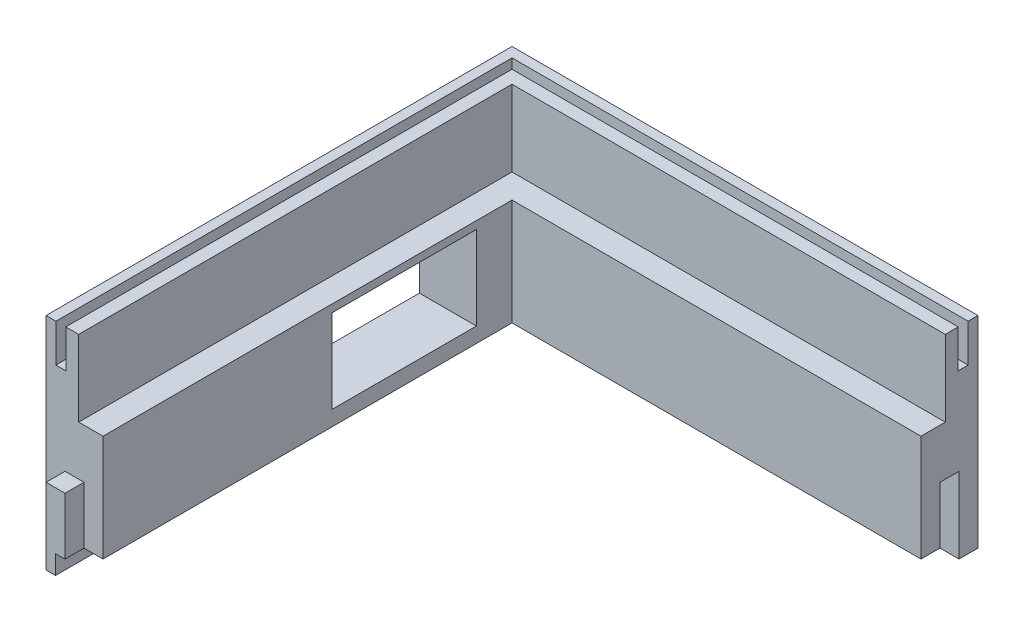
ISO-10303-21;
HEADER;
FILE_DESCRIPTION(('STEP AP214'),'2;1');
FILE_NAME('part.step','',(''),(''),'','','');
FILE_SCHEMA(('AUTOMOTIVE_DESIGN { 1 0 10303 214 1 1 1 1 }'));
ENDSEC;
DATA;
#1=APPLICATION_CONTEXT('core data for automotive mechanical design processes');
#2=APPLICATION_PROTOCOL_DEFINITION('international standard','automotive_design',2000,#1);
#3=PRODUCT_CONTEXT('',#1,'mechanical');
#4=PRODUCT('Part','Part','',(#3));
#5=PRODUCT_RELATED_PRODUCT_CATEGORY('part','',(#4));
#6=PRODUCT_DEFINITION_FORMATION('','',#4);
#7=PRODUCT_DEFINITION_CONTEXT('part definition',#1,'design');
#8=PRODUCT_DEFINITION('design','',#6,#7);
#9=PRODUCT_DEFINITION_SHAPE('','',#8);
#10=(LENGTH_UNIT() NAMED_UNIT(*) SI_UNIT(.MILLI.,.METRE.));
#11=(NAMED_UNIT(*) PLANE_ANGLE_UNIT() SI_UNIT($,.RADIAN.));
#12=(NAMED_UNIT(*) SI_UNIT($,.STERADIAN.) SOLID_ANGLE_UNIT());
#13=UNCERTAINTY_MEASURE_WITH_UNIT(LENGTH_MEASURE(1.E-05),#10,'distance_accuracy_value','');
#14=(GEOMETRIC_REPRESENTATION_CONTEXT(3) GLOBAL_UNCERTAINTY_ASSIGNED_CONTEXT((#13)) GLOBAL_UNIT_ASSIGNED_CONTEXT((#10,
#11,#12)) REPRESENTATION_CONTEXT('',''));
#15=CARTESIAN_POINT('',(0.,0.,0.));
#16=DIRECTION('',(0.,0.,1.));
#17=DIRECTION('',(1.,0.,0.));
#18=AXIS2_PLACEMENT_3D('',#15,#16,#17);
#19=CARTESIAN_POINT('',(88.7463944008104,0.,0.));
#20=DIRECTION('',(-1.,0.,0.));
#21=DIRECTION('',(0.,0.,1.));
#22=AXIS2_PLACEMENT_3D('',#19,#20,#21);
#23=PLANE('',#22);
#24=DIRECTION('',(0.,1.,0.));
#25=VECTOR('',#24,1.);
#26=CARTESIAN_POINT('',(88.7463944008104,-377.380678756983,-28.1385049718995));
#27=LINE('',#26,#25);
#28=CARTESIAN_POINT('',(88.7463944008104,0.,-28.1385049718995));
#29=VERTEX_POINT('',#28);
#30=CARTESIAN_POINT('',(88.7463944008104,6.35,-28.1385049718995));
#31=VERTEX_POINT('',#30);
#32=EDGE_CURVE('E277',#29,#31,#27,.T.);
#33=ORIENTED_EDGE('',*,*,#32,.F.);
#34=DIRECTION('',(0.,0.,-1.));
#35=VECTOR('',#34,1.);
#36=CARTESIAN_POINT('',(88.7463944008104,0.,-24.9635049718995));
#37=LINE('',#36,#35);
#38=CARTESIAN_POINT('',(88.7463944008104,0.,-31.3135049718995));
#39=VERTEX_POINT('',#38);
#40=EDGE_CURVE('E325',#29,#39,#37,.T.);
#41=ORIENTED_EDGE('',*,*,#40,.T.);
#42=DIRECTION('',(0.,1.,0.));
#43=VECTOR('',#42,1.);
#44=CARTESIAN_POINT('',(88.7463944008104,0.,-31.3135049718995));
#45=LINE('',#44,#43);
#46=CARTESIAN_POINT('',(88.7463944008104,25.4,-31.3135049718995));
#47=VERTEX_POINT('',#46);
#48=EDGE_CURVE('E328',#39,#47,#45,.T.);
#49=ORIENTED_EDGE('',*,*,#48,.T.);
#50=DIRECTION('',(0.,0.,1.));
#51=VECTOR('',#50,1.);
#52=CARTESIAN_POINT('',(88.7463944008104,25.4,-24.9635049718995));
#53=LINE('',#52,#51);
#54=CARTESIAN_POINT('',(88.7463944008104,25.4,-24.9635049718995));
#55=VERTEX_POINT('',#54);
#56=EDGE_CURVE('E331',#47,#55,#53,.T.);
#57=ORIENTED_EDGE('',*,*,#56,.T.);
#58=DIRECTION('',(0.,-1.,0.));
#59=VECTOR('',#58,1.);
#60=CARTESIAN_POINT('',(88.7463944008104,0.,-24.9635049718995));
#61=LINE('',#60,#59);
#62=CARTESIAN_POINT('',(88.7463944008104,6.35,-24.9635049718995));
#63=VERTEX_POINT('',#62);
#64=EDGE_CURVE('E322',#55,#63,#61,.T.);
#65=ORIENTED_EDGE('',*,*,#64,.T.);
#66=DIRECTION('',(0.,0.,-1.));
#67=VECTOR('',#66,1.);
#68=CARTESIAN_POINT('',(88.7463944008104,6.35,-24.9635049718995));
#69=LINE('',#68,#67);
#70=EDGE_CURVE('E273',#63,#31,#69,.T.);
#71=ORIENTED_EDGE('',*,*,#70,.T.);
#72=EDGE_LOOP('',(#33,#41,#49,#57,#65,#71));
#73=FACE_BOUND('',#72,.T.);
#74=ADVANCED_FACE('F33',(#73),#23,.F.);
#75=CARTESIAN_POINT('',(0.,67.31,0.));
#76=DIRECTION('',(0.,1.,0.));
#77=DIRECTION('',(0.,0.,1.));
#78=AXIS2_PLACEMENT_3D('',#75,#76,#77);
#79=PLANE('',#78);
#80=DIRECTION('',(0.,0.,1.));
#81=VECTOR('',#80,1.);
#82=CARTESIAN_POINT('',(-57.3036055991896,67.31,118.0384950281));
#83=LINE('',#82,#81);
#84=CARTESIAN_POINT('',(-57.3036055991896,67.31,-34.3615049718995));
#85=VERTEX_POINT('',#84);
#86=CARTESIAN_POINT('',(-57.3036055991896,67.31,118.0384950281));
#87=VERTEX_POINT('',#86);
#88=EDGE_CURVE('E406',#85,#87,#83,.T.);
#89=ORIENTED_EDGE('',*,*,#88,.F.);
#90=DIRECTION('',(-1.,0.,0.));
#91=VECTOR('',#90,1.);
#92=CARTESIAN_POINT('',(-57.3036055991896,67.31,-34.3615049718995));
#93=LINE('',#92,#91);
#94=CARTESIAN_POINT('',(95.0963944008104,67.31,-34.3615049718995));
#95=VERTEX_POINT('',#94);
#96=EDGE_CURVE('E426',#95,#85,#93,.T.);
#97=ORIENTED_EDGE('',*,*,#96,.F.);
#98=DIRECTION('',(0.,0.,1.));
#99=VECTOR('',#98,1.);
#100=CARTESIAN_POINT('',(95.0963944008104,67.31,-37.6635049718995));
#101=LINE('',#100,#99);
#102=CARTESIAN_POINT('',(95.0963944008104,67.31,-37.6635049718995));
#103=VERTEX_POINT('',#102);
#104=EDGE_CURVE('E455',#103,#95,#101,.T.);
#105=ORIENTED_EDGE('',*,*,#104,.F.);
#106=DIRECTION('',(1.,0.,0.));
#107=VECTOR('',#106,1.);
#108=CARTESIAN_POINT('',(-60.6056055991896,67.31,-37.6635049718995));
#109=LINE('',#108,#107);
#110=CARTESIAN_POINT('',(-60.6056055991896,67.31,-37.6635049718995));
#111=VERTEX_POINT('',#110);
#112=EDGE_CURVE('E451',#111,#103,#109,.T.);
#113=ORIENTED_EDGE('',*,*,#112,.F.);
#114=DIRECTION('',(0.,0.,-1.));
#115=VECTOR('',#114,1.);
#116=CARTESIAN_POINT('',(-60.6056055991896,67.31,118.0384950281));
#117=LINE('',#116,#115);
#118=CARTESIAN_POINT('',(-60.6056055991896,67.31,118.0384950281));
#119=VERTEX_POINT('',#118);
#120=EDGE_CURVE('E447',#119,#111,#117,.T.);
#121=ORIENTED_EDGE('',*,*,#120,.F.);
#122=DIRECTION('',(-1.,0.,0.));
#123=VECTOR('',#122,1.);
#124=CARTESIAN_POINT('',(-41.5556055991896,67.31,118.0384950281));
#125=LINE('',#124,#123);
#126=EDGE_CURVE('E448',#87,#119,#125,.T.);
#127=ORIENTED_EDGE('',*,*,#126,.F.);
#128=EDGE_LOOP('',(#89,#97,#105,#113,#121,#127));
#129=FACE_BOUND('',#128,.T.);
#130=ADVANCED_FACE('F552',(#129),#79,.T.);
#131=CARTESIAN_POINT('',(95.0963944008104,67.31,-18.6135049718995));
#132=DIRECTION('',(0.,0.,1.));
#133=DIRECTION('',(1.,0.,0.));
#134=AXIS2_PLACEMENT_3D('',#131,#132,#133);
#135=PLANE('',#134);
#136=DIRECTION('',(-1.,0.,0.));
#137=VECTOR('',#136,1.);
#138=CARTESIAN_POINT('',(95.0963944008104,6.35,-18.6135049718995));
#139=LINE('',#138,#137);
#140=CARTESIAN_POINT('',(95.0963944008104,6.35,-18.6135049718995));
#141=VERTEX_POINT('',#140);
#142=CARTESIAN_POINT('',(-41.5556055991896,6.35,-18.6135049718995));
#143=VERTEX_POINT('',#142);
#144=EDGE_CURVE('E311',#141,#143,#139,.T.);
#145=ORIENTED_EDGE('',*,*,#144,.F.);
#146=DIRECTION('',(0.,-1.,0.));
#147=VECTOR('',#146,1.);
#148=CARTESIAN_POINT('',(95.0963944008104,67.31,-18.6135049718995));
#149=LINE('',#148,#147);
#150=CARTESIAN_POINT('',(95.0963944008104,41.91,-18.6135049718995));
#151=VERTEX_POINT('',#150);
#152=EDGE_CURVE('E11',#151,#141,#149,.T.);
#153=ORIENTED_EDGE('',*,*,#152,.F.);
#154=DIRECTION('',(1.,0.,0.));
#155=VECTOR('',#154,1.);
#156=CARTESIAN_POINT('',(95.0963944008104,41.91,-18.6135049718995));
#157=LINE('',#156,#155);
#158=CARTESIAN_POINT('',(-41.5556055991896,41.91,-18.6135049718995));
#159=VERTEX_POINT('',#158);
#160=EDGE_CURVE('E380',#159,#151,#157,.T.);
#161=ORIENTED_EDGE('',*,*,#160,.F.);
#162=DIRECTION('',(0.,-1.,0.));
#163=VECTOR('',#162,1.);
#164=CARTESIAN_POINT('',(-41.5556055991896,67.31,-18.6135049718995));
#165=LINE('',#164,#163);
#166=EDGE_CURVE('E37',#159,#143,#165,.T.);
#167=ORIENTED_EDGE('',*,*,#166,.T.);
#168=EDGE_LOOP('',(#145,#153,#161,#167));
#169=FACE_BOUND('',#168,.T.);
#170=ADVANCED_FACE('F35',(#169),#135,.T.);
#171=CARTESIAN_POINT('',(95.0963944008104,67.31,-37.6635049718995));
#172=DIRECTION('',(1.,0.,0.));
#173=DIRECTION('',(0.,0.,-1.));
#174=AXIS2_PLACEMENT_3D('',#171,#172,#173);
#175=PLANE('',#174);
#176=DIRECTION('',(0.,0.,1.));
#177=VECTOR('',#176,1.);
#178=CARTESIAN_POINT('',(95.0963944008104,6.35,-37.6635049718995));
#179=LINE('',#178,#177);
#180=CARTESIAN_POINT('',(95.0963944008104,6.35,-24.9635049718995));
#181=VERTEX_POINT('',#180);
#182=EDGE_CURVE('E309',#181,#141,#179,.T.);
#183=ORIENTED_EDGE('',*,*,#182,.F.);
#184=DIRECTION('',(0.,-1.,0.));
#185=VECTOR('',#184,1.);
#186=CARTESIAN_POINT('',(95.0963944008104,0.,-24.9635049718995));
#187=LINE('',#186,#185);
#188=CARTESIAN_POINT('',(95.0963944008104,25.4,-24.9635049718995));
#189=VERTEX_POINT('',#188);
#190=EDGE_CURVE('E304',#189,#181,#187,.T.);
#191=ORIENTED_EDGE('',*,*,#190,.F.);
#192=DIRECTION('',(0.,0.,1.));
#193=VECTOR('',#192,1.);
#194=CARTESIAN_POINT('',(95.0963944008104,25.4,-24.9635049718995));
#195=LINE('',#194,#193);
#196=CARTESIAN_POINT('',(95.0963944008104,25.4,-31.3135049718995));
#197=VERTEX_POINT('',#196);
#198=EDGE_CURVE('E326',#197,#189,#195,.T.);
#199=ORIENTED_EDGE('',*,*,#198,.F.);
#200=DIRECTION('',(0.,1.,0.));
#201=VECTOR('',#200,1.);
#202=CARTESIAN_POINT('',(95.0963944008104,0.,-31.3135049718995));
#203=LINE('',#202,#201);
#204=CARTESIAN_POINT('',(95.0963944008104,0.,-31.3135049718995));
#205=VERTEX_POINT('',#204);
#206=EDGE_CURVE('E337',#205,#197,#203,.T.);
#207=ORIENTED_EDGE('',*,*,#206,.F.);
#208=DIRECTION('',(0.,0.,1.));
#209=VECTOR('',#208,1.);
#210=CARTESIAN_POINT('',(95.0963944008104,0.,-37.6635049718995));
#211=LINE('',#210,#209);
#212=CARTESIAN_POINT('',(95.0963944008104,0.,-37.6635049718995));
#213=VERTEX_POINT('',#212);
#214=EDGE_CURVE('E465',#213,#205,#211,.T.);
#215=ORIENTED_EDGE('',*,*,#214,.F.);
#216=DIRECTION('',(0.,-1.,0.));
#217=VECTOR('',#216,1.);
#218=CARTESIAN_POINT('',(95.0963944008104,67.31,-37.6635049718995));
#219=LINE('',#218,#217);
#220=EDGE_CURVE('E42',#103,#213,#219,.T.);
#221=ORIENTED_EDGE('',*,*,#220,.F.);
#222=ORIENTED_EDGE('',*,*,#104,.T.);
#223=DIRECTION('',(0.,1.,0.));
#224=VECTOR('',#223,1.);
#225=CARTESIAN_POINT('',(95.0963944008104,54.6166591658951,-34.3615049718995));
#226=LINE('',#225,#224);
#227=CARTESIAN_POINT('',(95.0963944008104,54.6166591658951,-34.3615049718995));
#228=VERTEX_POINT('',#227);
#229=EDGE_CURVE('E436',#228,#95,#226,.T.);
#230=ORIENTED_EDGE('',*,*,#229,.F.);
#231=DIRECTION('',(0.,0.,-1.));
#232=VECTOR('',#231,1.);
#233=CARTESIAN_POINT('',(95.0963944008104,54.6166591658951,-34.3615049718995));
#234=LINE('',#233,#232);
#235=CARTESIAN_POINT('',(95.0963944008104,54.6166591658951,-31.0595049718995));
#236=VERTEX_POINT('',#235);
#237=EDGE_CURVE('E412',#236,#228,#234,.T.);
#238=ORIENTED_EDGE('',*,*,#237,.F.);
#239=DIRECTION('',(0.,1.,0.));
#240=VECTOR('',#239,1.);
#241=CARTESIAN_POINT('',(95.0963944008104,54.6166591658951,-31.0595049718995));
#242=LINE('',#241,#240);
#243=CARTESIAN_POINT('',(95.0963944008104,67.31,-31.0595049718995));
#244=VERTEX_POINT('',#243);
#245=EDGE_CURVE('E438',#236,#244,#242,.T.);
#246=ORIENTED_EDGE('',*,*,#245,.T.);
#247=CARTESIAN_POINT('',(95.0963944008104,67.31,-26.7415049718995));
#248=VERTEX_POINT('',#247);
#249=EDGE_CURVE('E454',#244,#248,#101,.T.);
#250=ORIENTED_EDGE('',*,*,#249,.T.);
#251=DIRECTION('',(0.,1.,0.));
#252=VECTOR('',#251,1.);
#253=CARTESIAN_POINT('',(95.0963944008104,41.91,-26.7415049718995));
#254=LINE('',#253,#252);
#255=CARTESIAN_POINT('',(95.0963944008104,41.91,-26.7415049718995));
#256=VERTEX_POINT('',#255);
#257=EDGE_CURVE('E391',#256,#248,#254,.T.);
#258=ORIENTED_EDGE('',*,*,#257,.F.);
#259=DIRECTION('',(0.,0.,-1.));
#260=VECTOR('',#259,1.);
#261=CARTESIAN_POINT('',(95.0963944008104,41.91,-26.7415049718995));
#262=LINE('',#261,#260);
#263=EDGE_CURVE('E382',#151,#256,#262,.T.);
#264=ORIENTED_EDGE('',*,*,#263,.F.);
#265=ORIENTED_EDGE('',*,*,#152,.T.);
#266=EDGE_LOOP('',(#183,#191,#199,#207,#215,#221,#222,#230,#238,#246,#250,#258,#264,#265));
#267=FACE_BOUND('',#266,.T.);
#268=ADVANCED_FACE('F521',(#267),#175,.T.);
#269=CARTESIAN_POINT('',(-60.6056055991896,67.31,-37.6635049718995));
#270=DIRECTION('',(0.,0.,-1.));
#271=DIRECTION('',(-1.,0.,0.));
#272=AXIS2_PLACEMENT_3D('',#269,#270,#271);
#273=PLANE('',#272);
#274=DIRECTION('',(1.,0.,0.));
#275=VECTOR('',#274,1.);
#276=CARTESIAN_POINT('',(-60.6056055991896,0.,-37.6635049718995));
#277=LINE('',#276,#275);
#278=CARTESIAN_POINT('',(-60.6056055991896,0.,-37.6635049718995));
#279=VERTEX_POINT('',#278);
#280=EDGE_CURVE('E462',#279,#213,#277,.T.);
#281=ORIENTED_EDGE('',*,*,#280,.F.);
#282=DIRECTION('',(0.,-1.,0.));
#283=VECTOR('',#282,1.);
#284=CARTESIAN_POINT('',(-60.6056055991896,67.31,-37.6635049718995));
#285=LINE('',#284,#283);
#286=EDGE_CURVE('E469',#111,#279,#285,.T.);
#287=ORIENTED_EDGE('',*,*,#286,.F.);
#288=ORIENTED_EDGE('',*,*,#112,.T.);
#289=ORIENTED_EDGE('',*,*,#220,.T.);
#290=EDGE_LOOP('',(#281,#287,#288,#289));
#291=FACE_BOUND('',#290,.T.);
#292=ADVANCED_FACE('F800',(#291),#273,.T.);
#293=CARTESIAN_POINT('',(-60.6056055991896,67.31,118.0384950281));
#294=DIRECTION('',(-1.,0.,0.));
#295=DIRECTION('',(0.,0.,1.));
#296=AXIS2_PLACEMENT_3D('',#293,#294,#295);
#297=PLANE('',#296);
#298=DIRECTION('',(0.,1.,0.));
#299=VECTOR('',#298,1.);
#300=CARTESIAN_POINT('',(-60.6056055991896,67.31,41.5425024108202));
#301=LINE('',#300,#299);
#302=CARTESIAN_POINT('',(-60.6056055991896,11.4097797063347,41.5425024108202));
#303=VERTEX_POINT('',#302);
#304=CARTESIAN_POINT('',(-60.6056055991896,39.3497797063347,41.5425024108202));
#305=VERTEX_POINT('',#304);
#306=EDGE_CURVE('E271',#303,#305,#301,.T.);
#307=ORIENTED_EDGE('',*,*,#306,.F.);
#308=DIRECTION('',(0.,0.,1.));
#309=VECTOR('',#308,1.);
#310=CARTESIAN_POINT('',(-60.6056055991896,11.4097797063347,118.0384950281));
#311=LINE('',#310,#309);
#312=CARTESIAN_POINT('',(-60.6056055991896,11.4097797063347,-6.71749758917975));
#313=VERTEX_POINT('',#312);
#314=EDGE_CURVE('E264',#313,#303,#311,.T.);
#315=ORIENTED_EDGE('',*,*,#314,.F.);
#316=DIRECTION('',(0.,-1.,0.));
#317=VECTOR('',#316,1.);
#318=CARTESIAN_POINT('',(-60.6056055991896,67.31,-6.71749758917975));
#319=LINE('',#318,#317);
#320=CARTESIAN_POINT('',(-60.6056055991896,39.3497797063347,-6.71749758917975));
#321=VERTEX_POINT('',#320);
#322=EDGE_CURVE('E244',#321,#313,#319,.T.);
#323=ORIENTED_EDGE('',*,*,#322,.F.);
#324=DIRECTION('',(0.,0.,-1.));
#325=VECTOR('',#324,1.);
#326=CARTESIAN_POINT('',(-60.6056055991896,39.3497797063347,118.0384950281));
#327=LINE('',#326,#325);
#328=EDGE_CURVE('E269',#305,#321,#327,.T.);
#329=ORIENTED_EDGE('',*,*,#328,.F.);
#330=EDGE_LOOP('',(#307,#315,#323,#329));
#331=FACE_BOUND('',#330,.T.);
#332=DIRECTION('',(0.,0.,-1.));
#333=VECTOR('',#332,1.);
#334=CARTESIAN_POINT('',(-60.6056055991896,0.,118.0384950281));
#335=LINE('',#334,#333);
#336=CARTESIAN_POINT('',(-60.6056055991896,0.,118.0384950281));
#337=VERTEX_POINT('',#336);
#338=EDGE_CURVE('E459',#337,#279,#335,.T.);
#339=ORIENTED_EDGE('',*,*,#338,.F.);
#340=DIRECTION('',(0.,-1.,0.));
#341=VECTOR('',#340,1.);
#342=CARTESIAN_POINT('',(-60.6056055991896,67.31,118.0384950281));
#343=LINE('',#342,#341);
#344=EDGE_CURVE('E471',#119,#337,#343,.T.);
#345=ORIENTED_EDGE('',*,*,#344,.F.);
#346=ORIENTED_EDGE('',*,*,#120,.T.);
#347=ORIENTED_EDGE('',*,*,#286,.T.);
#348=EDGE_LOOP('',(#339,#345,#346,#347));
#349=FACE_BOUND('',#348,.T.);
#350=ADVANCED_FACE('F559',(#331,#349),#297,.T.);
#351=CARTESIAN_POINT('',(-41.5556055991896,67.31,118.0384950281));
#352=DIRECTION('',(0.,0.,1.));
#353=DIRECTION('',(1.,0.,0.));
#354=AXIS2_PLACEMENT_3D('',#351,#352,#353);
#355=PLANE('',#354);
#356=DIRECTION('',(-1.,0.,0.));
#357=VECTOR('',#356,1.);
#358=CARTESIAN_POINT('',(-41.5556055991896,6.35,118.0384950281));
#359=LINE('',#358,#357);
#360=CARTESIAN_POINT('',(-41.5556055991896,6.35,118.0384950281));
#361=VERTEX_POINT('',#360);
#362=CARTESIAN_POINT('',(-47.9056055991896,6.35,118.0384950281));
#363=VERTEX_POINT('',#362);
#364=EDGE_CURVE('E315',#361,#363,#359,.T.);
#365=ORIENTED_EDGE('',*,*,#364,.F.);
#366=DIRECTION('',(0.,-1.,0.));
#367=VECTOR('',#366,1.);
#368=CARTESIAN_POINT('',(-41.5556055991896,67.31,118.0384950281));
#369=LINE('',#368,#367);
#370=CARTESIAN_POINT('',(-41.5556055991896,41.91,118.0384950281));
#371=VERTEX_POINT('',#370);
#372=EDGE_CURVE('E473',#371,#361,#369,.T.);
#373=ORIENTED_EDGE('',*,*,#372,.F.);
#374=DIRECTION('',(1.,0.,0.));
#375=VECTOR('',#374,1.);
#376=CARTESIAN_POINT('',(-41.5556055991896,41.91,118.0384950281));
#377=LINE('',#376,#375);
#378=CARTESIAN_POINT('',(-49.6836055991896,41.91,118.0384950281));
#379=VERTEX_POINT('',#378);
#380=EDGE_CURVE('E375',#379,#371,#377,.T.);
#381=ORIENTED_EDGE('',*,*,#380,.F.);
#382=DIRECTION('',(0.,1.,0.));
#383=VECTOR('',#382,1.);
#384=CARTESIAN_POINT('',(-49.6836055991896,41.91,118.0384950281));
#385=LINE('',#384,#383);
#386=CARTESIAN_POINT('',(-49.6836055991896,67.31,118.0384950281));
#387=VERTEX_POINT('',#386);
#388=EDGE_CURVE('E395',#379,#387,#385,.T.);
#389=ORIENTED_EDGE('',*,*,#388,.T.);
#390=CARTESIAN_POINT('',(-54.0016055991896,67.31,118.0384950281));
#391=VERTEX_POINT('',#390);
#392=EDGE_CURVE('E445',#387,#391,#125,.T.);
#393=ORIENTED_EDGE('',*,*,#392,.T.);
#394=DIRECTION('',(0.,1.,0.));
#395=VECTOR('',#394,1.);
#396=CARTESIAN_POINT('',(-54.0016055991896,54.6166591658951,118.038495028101));
#397=LINE('',#396,#395);
#398=CARTESIAN_POINT('',(-54.0016055991896,54.6166591658951,118.038495028101));
#399=VERTEX_POINT('',#398);
#400=EDGE_CURVE('E421',#399,#391,#397,.T.);
#401=ORIENTED_EDGE('',*,*,#400,.F.);
#402=DIRECTION('',(1.,0.,0.));
#403=VECTOR('',#402,1.);
#404=CARTESIAN_POINT('',(-57.3036055991896,54.6166591658951,118.0384950281));
#405=LINE('',#404,#403);
#406=CARTESIAN_POINT('',(-57.3036055991896,54.6166591658951,118.0384950281));
#407=VERTEX_POINT('',#406);
#408=EDGE_CURVE('E402',#407,#399,#405,.T.);
#409=ORIENTED_EDGE('',*,*,#408,.F.);
#410=DIRECTION('',(0.,1.,0.));
#411=VECTOR('',#410,1.);
#412=CARTESIAN_POINT('',(-57.3036055991896,54.6166591658951,118.0384950281));
#413=LINE('',#412,#411);
#414=EDGE_CURVE('E430',#407,#87,#413,.T.);
#415=ORIENTED_EDGE('',*,*,#414,.T.);
#416=ORIENTED_EDGE('',*,*,#126,.T.);
#417=ORIENTED_EDGE('',*,*,#344,.T.);
#418=DIRECTION('',(-1.,0.,0.));
#419=VECTOR('',#418,1.);
#420=CARTESIAN_POINT('',(-41.5556055991896,0.,118.0384950281));
#421=LINE('',#420,#419);
#422=CARTESIAN_POINT('',(-54.2556055991896,0.,118.0384950281));
#423=VERTEX_POINT('',#422);
#424=EDGE_CURVE('E433',#423,#337,#421,.T.);
#425=ORIENTED_EDGE('',*,*,#424,.F.);
#426=DIRECTION('',(0.,-1.,0.));
#427=VECTOR('',#426,1.);
#428=CARTESIAN_POINT('',(-54.2556055991896,0.,118.0384950281));
#429=LINE('',#428,#427);
#430=CARTESIAN_POINT('',(-54.2556055991896,25.4,118.0384950281));
#431=VERTEX_POINT('',#430);
#432=EDGE_CURVE('E344',#431,#423,#429,.T.);
#433=ORIENTED_EDGE('',*,*,#432,.F.);
#434=DIRECTION('',(-1.,0.,0.));
#435=VECTOR('',#434,1.);
#436=CARTESIAN_POINT('',(-54.2556055991896,25.4,118.0384950281));
#437=LINE('',#436,#435);
#438=CARTESIAN_POINT('',(-47.9056055991896,25.4,118.0384950281));
#439=VERTEX_POINT('',#438);
#440=EDGE_CURVE('E352',#439,#431,#437,.T.);
#441=ORIENTED_EDGE('',*,*,#440,.F.);
#442=DIRECTION('',(0.,1.,0.));
#443=VECTOR('',#442,1.);
#444=CARTESIAN_POINT('',(-47.9056055991896,0.,118.0384950281));
#445=LINE('',#444,#443);
#446=EDGE_CURVE('E362',#363,#439,#445,.T.);
#447=ORIENTED_EDGE('',*,*,#446,.F.);
#448=EDGE_LOOP('',(#365,#373,#381,#389,#393,#401,#409,#415,#416,#417,#425,#433,#441,#447));
#449=FACE_BOUND('',#448,.T.);
#450=ADVANCED_FACE('F489',(#449),#355,.T.);
#451=CARTESIAN_POINT('',(-41.5556055991896,67.31,-18.6135049718995));
#452=DIRECTION('',(1.,0.,0.));
#453=DIRECTION('',(0.,0.,-1.));
#454=AXIS2_PLACEMENT_3D('',#451,#452,#453);
#455=PLANE('',#454);
#456=DIRECTION('',(0.,-1.,0.));
#457=VECTOR('',#456,1.);
#458=CARTESIAN_POINT('',(-41.5556055991896,39.3497797063347,41.5425024108202));
#459=LINE('',#458,#457);
#460=CARTESIAN_POINT('',(-41.5556055991896,39.3497797063347,41.5425024108202));
#461=VERTEX_POINT('',#460);
#462=CARTESIAN_POINT('',(-41.5556055991896,11.4097797063347,41.5425024108202));
#463=VERTEX_POINT('',#462);
#464=EDGE_CURVE('E58',#461,#463,#459,.T.);
#465=ORIENTED_EDGE('',*,*,#464,.F.);
#466=DIRECTION('',(0.,0.,1.));
#467=VECTOR('',#466,1.);
#468=CARTESIAN_POINT('',(-41.5556055991896,39.3497797063347,41.5425024108202));
#469=LINE('',#468,#467);
#470=CARTESIAN_POINT('',(-41.5556055991896,39.3497797063347,-6.71749758917975));
#471=VERTEX_POINT('',#470);
#472=EDGE_CURVE('E257',#471,#461,#469,.T.);
#473=ORIENTED_EDGE('',*,*,#472,.F.);
#474=DIRECTION('',(0.,1.,0.));
#475=VECTOR('',#474,1.);
#476=CARTESIAN_POINT('',(-41.5556055991896,39.3497797063347,-6.71749758917975));
#477=LINE('',#476,#475);
#478=CARTESIAN_POINT('',(-41.5556055991896,11.4097797063347,-6.71749758917975));
#479=VERTEX_POINT('',#478);
#480=EDGE_CURVE('E241',#479,#471,#477,.T.);
#481=ORIENTED_EDGE('',*,*,#480,.F.);
#482=DIRECTION('',(0.,0.,-1.));
#483=VECTOR('',#482,1.);
#484=CARTESIAN_POINT('',(-41.5556055991896,11.4097797063347,41.5425024108202));
#485=LINE('',#484,#483);
#486=EDGE_CURVE('E250',#463,#479,#485,.T.);
#487=ORIENTED_EDGE('',*,*,#486,.F.);
#488=EDGE_LOOP('',(#465,#473,#481,#487));
#489=FACE_BOUND('',#488,.T.);
#490=DIRECTION('',(0.,0.,1.));
#491=VECTOR('',#490,1.);
#492=CARTESIAN_POINT('',(-41.5556055991896,6.35,-18.6135049718995));
#493=LINE('',#492,#491);
#494=EDGE_CURVE('E313',#143,#361,#493,.T.);
#495=ORIENTED_EDGE('',*,*,#494,.F.);
#496=ORIENTED_EDGE('',*,*,#166,.F.);
#497=DIRECTION('',(0.,0.,-1.));
#498=VECTOR('',#497,1.);
#499=CARTESIAN_POINT('',(-41.5556055991896,41.91,-18.6135049718995));
#500=LINE('',#499,#498);
#501=EDGE_CURVE('E377',#371,#159,#500,.T.);
#502=ORIENTED_EDGE('',*,*,#501,.F.);
#503=ORIENTED_EDGE('',*,*,#372,.T.);
#504=EDGE_LOOP('',(#495,#496,#502,#503));
#505=FACE_BOUND('',#504,.T.);
#506=ADVANCED_FACE('F254',(#489,#505),#455,.T.);
#507=DIRECTION('',(0.,0.,1.));
#508=VECTOR('',#507,1.);
#509=CARTESIAN_POINT('',(-49.6836055991896,67.31,118.0384950281));
#510=LINE('',#509,#508);
#511=CARTESIAN_POINT('',(-49.6836055991896,67.31,-26.7415049718995));
#512=VERTEX_POINT('',#511);
#513=EDGE_CURVE('E378',#512,#387,#510,.T.);
#514=ORIENTED_EDGE('',*,*,#513,.F.);
#515=DIRECTION('',(-1.,0.,0.));
#516=VECTOR('',#515,1.);
#517=CARTESIAN_POINT('',(-49.6836055991896,67.31,-26.7415049718995));
#518=LINE('',#517,#516);
#519=EDGE_CURVE('E374',#248,#512,#518,.T.);
#520=ORIENTED_EDGE('',*,*,#519,.F.);
#521=ORIENTED_EDGE('',*,*,#249,.F.);
#522=DIRECTION('',(1.,0.,0.));
#523=VECTOR('',#522,1.);
#524=CARTESIAN_POINT('',(-54.0016055991896,67.31,-31.0595049718995));
#525=LINE('',#524,#523);
#526=CARTESIAN_POINT('',(-54.0016055991896,67.31,-31.0595049718995));
#527=VERTEX_POINT('',#526);
#528=EDGE_CURVE('E424',#527,#244,#525,.T.);
#529=ORIENTED_EDGE('',*,*,#528,.F.);
#530=DIRECTION('',(0.,0.,-1.));
#531=VECTOR('',#530,1.);
#532=CARTESIAN_POINT('',(-54.0016055991896,67.31,118.038495028101));
#533=LINE('',#532,#531);
#534=EDGE_CURVE('E398',#391,#527,#533,.T.);
#535=ORIENTED_EDGE('',*,*,#534,.F.);
#536=ORIENTED_EDGE('',*,*,#392,.F.);
#537=EDGE_LOOP('',(#514,#520,#521,#529,#535,#536));
#538=FACE_BOUND('',#537,.T.);
#539=ADVANCED_FACE('F535',(#538),#79,.T.);
#540=CARTESIAN_POINT('',(0.,0.,0.));
#541=DIRECTION('',(0.,1.,0.));
#542=DIRECTION('',(0.,0.,1.));
#543=AXIS2_PLACEMENT_3D('',#540,#541,#542);
#544=PLANE('',#543);
#545=DIRECTION('',(0.,0.,1.));
#546=VECTOR('',#545,1.);
#547=CARTESIAN_POINT('',(-51.0806055991896,0.,-28.1385049718995));
#548=LINE('',#547,#546);
#549=CARTESIAN_POINT('',(-51.0806055991896,0.,-28.1385049718995));
#550=VERTEX_POINT('',#549);
#551=CARTESIAN_POINT('',(-51.0806055991896,0.,-25.399651712803));
#552=VERTEX_POINT('',#551);
#553=EDGE_CURVE('E288',#550,#552,#548,.T.);
#554=ORIENTED_EDGE('',*,*,#553,.T.);
#555=DIRECTION('',(0.,0.,1.));
#556=VECTOR('',#555,1.);
#557=CARTESIAN_POINT('',(-51.0806055991896,0.,124.3884950281));
#558=LINE('',#557,#556);
#559=CARTESIAN_POINT('',(-51.0806055991896,0.,124.3884950281));
#560=VERTEX_POINT('',#559);
#561=EDGE_CURVE('E285',#552,#560,#558,.T.);
#562=ORIENTED_EDGE('',*,*,#561,.T.);
#563=DIRECTION('',(1.,0.,0.));
#564=VECTOR('',#563,1.);
#565=CARTESIAN_POINT('',(-54.2556055991896,0.,124.3884950281));
#566=LINE('',#565,#564);
#567=CARTESIAN_POINT('',(-54.2556055991896,0.,124.3884950281));
#568=VERTEX_POINT('',#567);
#569=EDGE_CURVE('E351',#568,#560,#566,.T.);
#570=ORIENTED_EDGE('',*,*,#569,.F.);
#571=DIRECTION('',(0.,0.,-1.));
#572=VECTOR('',#571,1.);
#573=CARTESIAN_POINT('',(-54.2556055991896,0.,124.3884950281));
#574=LINE('',#573,#572);
#575=EDGE_CURVE('E371',#568,#423,#574,.T.);
#576=ORIENTED_EDGE('',*,*,#575,.T.);
#577=ORIENTED_EDGE('',*,*,#424,.T.);
#578=ORIENTED_EDGE('',*,*,#338,.T.);
#579=ORIENTED_EDGE('',*,*,#280,.T.);
#580=ORIENTED_EDGE('',*,*,#214,.T.);
#581=DIRECTION('',(1.,0.,0.));
#582=VECTOR('',#581,1.);
#583=CARTESIAN_POINT('',(88.7463944008104,0.,-31.3135049718995));
#584=LINE('',#583,#582);
#585=EDGE_CURVE('E334',#39,#205,#584,.T.);
#586=ORIENTED_EDGE('',*,*,#585,.F.);
#587=ORIENTED_EDGE('',*,*,#40,.F.);
#588=DIRECTION('',(-1.,0.,0.));
#589=VECTOR('',#588,1.);
#590=CARTESIAN_POINT('',(88.7463944008104,0.,-28.1385049718995));
#591=LINE('',#590,#589);
#592=EDGE_CURVE('E282',#29,#550,#591,.T.);
#593=ORIENTED_EDGE('',*,*,#592,.T.);
#594=EDGE_LOOP('',(#554,#562,#570,#576,#577,#578,#579,#580,#586,#587,#593));
#595=FACE_BOUND('',#594,.T.);
#596=ADVANCED_FACE('F503',(#595),#544,.F.);
#597=CARTESIAN_POINT('',(-57.3036055991896,54.6166591658951,118.0384950281));
#598=DIRECTION('',(-1.,0.,0.));
#599=DIRECTION('',(0.,0.,1.));
#600=AXIS2_PLACEMENT_3D('',#597,#598,#599);
#601=PLANE('',#600);
#602=ORIENTED_EDGE('',*,*,#88,.T.);
#603=ORIENTED_EDGE('',*,*,#414,.F.);
#604=DIRECTION('',(0.,0.,1.));
#605=VECTOR('',#604,1.);
#606=CARTESIAN_POINT('',(-57.3036055991896,54.6166591658951,118.0384950281));
#607=LINE('',#606,#605);
#608=CARTESIAN_POINT('',(-57.3036055991896,54.6166591658951,-34.3615049718995));
#609=VERTEX_POINT('',#608);
#610=EDGE_CURVE('E418',#609,#407,#607,.T.);
#611=ORIENTED_EDGE('',*,*,#610,.F.);
#612=DIRECTION('',(0.,1.,0.));
#613=VECTOR('',#612,1.);
#614=CARTESIAN_POINT('',(-57.3036055991896,54.6166591658951,-34.3615049718995));
#615=LINE('',#614,#613);
#616=EDGE_CURVE('E434',#609,#85,#615,.T.);
#617=ORIENTED_EDGE('',*,*,#616,.T.);
#618=EDGE_LOOP('',(#602,#603,#611,#617));
#619=FACE_BOUND('',#618,.T.);
#620=ADVANCED_FACE('F548',(#619),#601,.F.);
#621=CARTESIAN_POINT('',(-57.3036055991896,54.6166591658951,-34.3615049718995));
#622=DIRECTION('',(0.,0.,-1.));
#623=DIRECTION('',(-1.,0.,0.));
#624=AXIS2_PLACEMENT_3D('',#621,#622,#623);
#625=PLANE('',#624);
#626=ORIENTED_EDGE('',*,*,#96,.T.);
#627=ORIENTED_EDGE('',*,*,#616,.F.);
#628=DIRECTION('',(-1.,0.,0.));
#629=VECTOR('',#628,1.);
#630=CARTESIAN_POINT('',(-57.3036055991896,54.6166591658951,-34.3615049718995));
#631=LINE('',#630,#629);
#632=EDGE_CURVE('E415',#228,#609,#631,.T.);
#633=ORIENTED_EDGE('',*,*,#632,.F.);
#634=ORIENTED_EDGE('',*,*,#229,.T.);
#635=EDGE_LOOP('',(#626,#627,#633,#634));
#636=FACE_BOUND('',#635,.T.);
#637=ADVANCED_FACE('F777',(#636),#625,.F.);
#638=CARTESIAN_POINT('',(-54.0016055991896,54.6166591658951,-31.0595049718995));
#639=DIRECTION('',(0.,0.,1.));
#640=DIRECTION('',(1.,0.,0.));
#641=AXIS2_PLACEMENT_3D('',#638,#639,#640);
#642=PLANE('',#641);
#643=ORIENTED_EDGE('',*,*,#528,.T.);
#644=ORIENTED_EDGE('',*,*,#245,.F.);
#645=DIRECTION('',(1.,0.,0.));
#646=VECTOR('',#645,1.);
#647=CARTESIAN_POINT('',(-54.0016055991896,54.6166591658951,-31.0595049718995));
#648=LINE('',#647,#646);
#649=CARTESIAN_POINT('',(-54.0016055991896,54.6166591658951,-31.0595049718995));
#650=VERTEX_POINT('',#649);
#651=EDGE_CURVE('E409',#650,#236,#648,.T.);
#652=ORIENTED_EDGE('',*,*,#651,.F.);
#653=DIRECTION('',(0.,1.,0.));
#654=VECTOR('',#653,1.);
#655=CARTESIAN_POINT('',(-54.0016055991896,54.6166591658951,-31.0595049718995));
#656=LINE('',#655,#654);
#657=EDGE_CURVE('E441',#650,#527,#656,.T.);
#658=ORIENTED_EDGE('',*,*,#657,.T.);
#659=EDGE_LOOP('',(#643,#644,#652,#658));
#660=FACE_BOUND('',#659,.T.);
#661=ADVANCED_FACE('F785',(#660),#642,.F.);
#662=CARTESIAN_POINT('',(-54.0016055991896,54.6166591658951,118.038495028101));
#663=DIRECTION('',(1.,0.,0.));
#664=DIRECTION('',(0.,0.,-1.));
#665=AXIS2_PLACEMENT_3D('',#662,#663,#664);
#666=PLANE('',#665);
#667=ORIENTED_EDGE('',*,*,#534,.T.);
#668=ORIENTED_EDGE('',*,*,#657,.F.);
#669=DIRECTION('',(0.,0.,-1.));
#670=VECTOR('',#669,1.);
#671=CARTESIAN_POINT('',(-54.0016055991896,54.6166591658951,118.038495028101));
#672=LINE('',#671,#670);
#673=EDGE_CURVE('E405',#399,#650,#672,.T.);
#674=ORIENTED_EDGE('',*,*,#673,.F.);
#675=ORIENTED_EDGE('',*,*,#400,.T.);
#676=EDGE_LOOP('',(#667,#668,#674,#675));
#677=FACE_BOUND('',#676,.T.);
#678=ADVANCED_FACE('F540',(#677),#666,.F.);
#679=CARTESIAN_POINT('',(0.,54.6166591658951,0.));
#680=DIRECTION('',(0.,1.,0.));
#681=DIRECTION('',(0.,0.,1.));
#682=AXIS2_PLACEMENT_3D('',#679,#680,#681);
#683=PLANE('',#682);
#684=ORIENTED_EDGE('',*,*,#408,.T.);
#685=ORIENTED_EDGE('',*,*,#673,.T.);
#686=ORIENTED_EDGE('',*,*,#651,.T.);
#687=ORIENTED_EDGE('',*,*,#237,.T.);
#688=ORIENTED_EDGE('',*,*,#632,.T.);
#689=ORIENTED_EDGE('',*,*,#610,.T.);
#690=EDGE_LOOP('',(#684,#685,#686,#687,#688,#689));
#691=FACE_BOUND('',#690,.T.);
#692=ADVANCED_FACE('F545',(#691),#683,.T.);
#693=CARTESIAN_POINT('',(-49.6836055991896,41.91,118.0384950281));
#694=DIRECTION('',(-1.,0.,0.));
#695=DIRECTION('',(0.,0.,1.));
#696=AXIS2_PLACEMENT_3D('',#693,#694,#695);
#697=PLANE('',#696);
#698=ORIENTED_EDGE('',*,*,#513,.T.);
#699=ORIENTED_EDGE('',*,*,#388,.F.);
#700=DIRECTION('',(0.,0.,1.));
#701=VECTOR('',#700,1.);
#702=CARTESIAN_POINT('',(-49.6836055991896,41.91,118.0384950281));
#703=LINE('',#702,#701);
#704=CARTESIAN_POINT('',(-49.6836055991896,41.91,-26.7415049718995));
#705=VERTEX_POINT('',#704);
#706=EDGE_CURVE('E388',#705,#379,#703,.T.);
#707=ORIENTED_EDGE('',*,*,#706,.F.);
#708=DIRECTION('',(0.,1.,0.));
#709=VECTOR('',#708,1.);
#710=CARTESIAN_POINT('',(-49.6836055991896,41.91,-26.7415049718995));
#711=LINE('',#710,#709);
#712=EDGE_CURVE('E399',#705,#512,#711,.T.);
#713=ORIENTED_EDGE('',*,*,#712,.T.);
#714=EDGE_LOOP('',(#698,#699,#707,#713));
#715=FACE_BOUND('',#714,.T.);
#716=ADVANCED_FACE('F736',(#715),#697,.F.);
#717=CARTESIAN_POINT('',(-49.6836055991896,41.91,-26.7415049718995));
#718=DIRECTION('',(0.,0.,-1.));
#719=DIRECTION('',(-1.,0.,0.));
#720=AXIS2_PLACEMENT_3D('',#717,#718,#719);
#721=PLANE('',#720);
#722=ORIENTED_EDGE('',*,*,#519,.T.);
#723=ORIENTED_EDGE('',*,*,#712,.F.);
#724=DIRECTION('',(-1.,0.,0.));
#725=VECTOR('',#724,1.);
#726=CARTESIAN_POINT('',(-49.6836055991896,41.91,-26.7415049718995));
#727=LINE('',#726,#725);
#728=EDGE_CURVE('E385',#256,#705,#727,.T.);
#729=ORIENTED_EDGE('',*,*,#728,.F.);
#730=ORIENTED_EDGE('',*,*,#257,.T.);
#731=EDGE_LOOP('',(#722,#723,#729,#730));
#732=FACE_BOUND('',#731,.T.);
#733=ADVANCED_FACE('F576',(#732),#721,.F.);
#734=CARTESIAN_POINT('',(0.,41.91,0.));
#735=DIRECTION('',(0.,-1.,0.));
#736=DIRECTION('',(0.,0.,-1.));
#737=AXIS2_PLACEMENT_3D('',#734,#735,#736);
#738=PLANE('',#737);
#739=ORIENTED_EDGE('',*,*,#380,.T.);
#740=ORIENTED_EDGE('',*,*,#501,.T.);
#741=ORIENTED_EDGE('',*,*,#160,.T.);
#742=ORIENTED_EDGE('',*,*,#263,.T.);
#743=ORIENTED_EDGE('',*,*,#728,.T.);
#744=ORIENTED_EDGE('',*,*,#706,.T.);
#745=EDGE_LOOP('',(#739,#740,#741,#742,#743,#744));
#746=FACE_BOUND('',#745,.T.);
#747=ADVANCED_FACE('F527',(#746),#738,.F.);
#748=CARTESIAN_POINT('',(-54.2556055991896,0.,124.3884950281));
#749=DIRECTION('',(1.,0.,0.));
#750=DIRECTION('',(0.,0.,-1.));
#751=AXIS2_PLACEMENT_3D('',#748,#749,#750);
#752=PLANE('',#751);
#753=ORIENTED_EDGE('',*,*,#432,.T.);
#754=ORIENTED_EDGE('',*,*,#575,.F.);
#755=DIRECTION('',(0.,-1.,0.));
#756=VECTOR('',#755,1.);
#757=CARTESIAN_POINT('',(-54.2556055991896,0.,124.3884950281));
#758=LINE('',#757,#756);
#759=CARTESIAN_POINT('',(-54.2556055991896,25.4,124.3884950281));
#760=VERTEX_POINT('',#759);
#761=EDGE_CURVE('E348',#760,#568,#758,.T.);
#762=ORIENTED_EDGE('',*,*,#761,.F.);
#763=DIRECTION('',(0.,0.,-1.));
#764=VECTOR('',#763,1.);
#765=CARTESIAN_POINT('',(-54.2556055991896,25.4,124.3884950281));
#766=LINE('',#765,#764);
#767=EDGE_CURVE('E359',#760,#431,#766,.T.);
#768=ORIENTED_EDGE('',*,*,#767,.T.);
#769=EDGE_LOOP('',(#753,#754,#762,#768));
#770=FACE_BOUND('',#769,.T.);
#771=ADVANCED_FACE('F568',(#770),#752,.F.);
#772=CARTESIAN_POINT('',(-47.9056055991896,0.,124.3884950281));
#773=DIRECTION('',(-1.,0.,0.));
#774=DIRECTION('',(0.,0.,1.));
#775=AXIS2_PLACEMENT_3D('',#772,#773,#774);
#776=PLANE('',#775);
#777=DIRECTION('',(0.,1.,0.));
#778=VECTOR('',#777,1.);
#779=CARTESIAN_POINT('',(-47.9056055991896,0.,124.3884950281));
#780=LINE('',#779,#778);
#781=CARTESIAN_POINT('',(-47.9056055991896,6.35,124.3884950281));
#782=VERTEX_POINT('',#781);
#783=CARTESIAN_POINT('',(-47.9056055991896,25.4,124.3884950281));
#784=VERTEX_POINT('',#783);
#785=EDGE_CURVE('E355',#782,#784,#780,.T.);
#786=ORIENTED_EDGE('',*,*,#785,.F.);
#787=DIRECTION('',(0.,0.,-1.));
#788=VECTOR('',#787,1.);
#789=CARTESIAN_POINT('',(-47.9056055991896,6.35,124.3884950281));
#790=LINE('',#789,#788);
#791=EDGE_CURVE('E317',#782,#363,#790,.T.);
#792=ORIENTED_EDGE('',*,*,#791,.T.);
#793=ORIENTED_EDGE('',*,*,#446,.T.);
#794=DIRECTION('',(0.,0.,-1.));
#795=VECTOR('',#794,1.);
#796=CARTESIAN_POINT('',(-47.9056055991896,25.4,124.3884950281));
#797=LINE('',#796,#795);
#798=EDGE_CURVE('E368',#784,#439,#797,.T.);
#799=ORIENTED_EDGE('',*,*,#798,.F.);
#800=EDGE_LOOP('',(#786,#792,#793,#799));
#801=FACE_BOUND('',#800,.T.);
#802=ADVANCED_FACE('F495',(#801),#776,.F.);
#803=CARTESIAN_POINT('',(-54.2556055991896,25.4,124.3884950281));
#804=DIRECTION('',(0.,-1.,0.));
#805=DIRECTION('',(0.,0.,-1.));
#806=AXIS2_PLACEMENT_3D('',#803,#804,#805);
#807=PLANE('',#806);
#808=ORIENTED_EDGE('',*,*,#440,.T.);
#809=ORIENTED_EDGE('',*,*,#767,.F.);
#810=DIRECTION('',(-1.,0.,0.));
#811=VECTOR('',#810,1.);
#812=CARTESIAN_POINT('',(-54.2556055991896,25.4,124.3884950281));
#813=LINE('',#812,#811);
#814=EDGE_CURVE('E357',#784,#760,#813,.T.);
#815=ORIENTED_EDGE('',*,*,#814,.F.);
#816=ORIENTED_EDGE('',*,*,#798,.T.);
#817=EDGE_LOOP('',(#808,#809,#815,#816));
#818=FACE_BOUND('',#817,.T.);
#819=ADVANCED_FACE('F566',(#818),#807,.F.);
#820=CARTESIAN_POINT('',(0.,0.,124.3884950281));
#821=DIRECTION('',(0.,0.,-1.));
#822=DIRECTION('',(-1.,0.,0.));
#823=AXIS2_PLACEMENT_3D('',#820,#821,#822);
#824=PLANE('',#823);
#825=ORIENTED_EDGE('',*,*,#569,.T.);
#826=DIRECTION('',(0.,1.,0.));
#827=VECTOR('',#826,1.);
#828=CARTESIAN_POINT('',(-51.0806055991896,-377.380678756983,124.3884950281));
#829=LINE('',#828,#827);
#830=CARTESIAN_POINT('',(-51.0806055991896,6.35000000000001,124.3884950281));
#831=VERTEX_POINT('',#830);
#832=EDGE_CURVE('E301',#560,#831,#829,.T.);
#833=ORIENTED_EDGE('',*,*,#832,.T.);
#834=DIRECTION('',(1.,0.,0.));
#835=VECTOR('',#834,1.);
#836=CARTESIAN_POINT('',(-54.2556055991896,6.35,124.3884950281));
#837=LINE('',#836,#835);
#838=EDGE_CURVE('E289',#831,#782,#837,.T.);
#839=ORIENTED_EDGE('',*,*,#838,.T.);
#840=ORIENTED_EDGE('',*,*,#785,.T.);
#841=ORIENTED_EDGE('',*,*,#814,.T.);
#842=ORIENTED_EDGE('',*,*,#761,.T.);
#843=EDGE_LOOP('',(#825,#833,#839,#840,#841,#842));
#844=FACE_BOUND('',#843,.T.);
#845=ADVANCED_FACE('F498',(#844),#824,.F.);
#846=CARTESIAN_POINT('',(88.7463944008104,0.,-24.9635049718995));
#847=DIRECTION('',(0.,0.,1.));
#848=DIRECTION('',(1.,0.,0.));
#849=AXIS2_PLACEMENT_3D('',#846,#847,#848);
#850=PLANE('',#849);
#851=ORIENTED_EDGE('',*,*,#190,.T.);
#852=DIRECTION('',(1.,0.,0.));
#853=VECTOR('',#852,1.);
#854=CARTESIAN_POINT('',(88.7463944008104,6.35,-24.9635049718995));
#855=LINE('',#854,#853);
#856=EDGE_CURVE('E307',#63,#181,#855,.T.);
#857=ORIENTED_EDGE('',*,*,#856,.F.);
#858=ORIENTED_EDGE('',*,*,#64,.F.);
#859=DIRECTION('',(1.,0.,0.));
#860=VECTOR('',#859,1.);
#861=CARTESIAN_POINT('',(88.7463944008104,25.4,-24.9635049718995));
#862=LINE('',#861,#860);
#863=EDGE_CURVE('E342',#55,#189,#862,.T.);
#864=ORIENTED_EDGE('',*,*,#863,.T.);
#865=EDGE_LOOP('',(#851,#857,#858,#864));
#866=FACE_BOUND('',#865,.T.);
#867=ADVANCED_FACE('F517',(#866),#850,.F.);
#868=CARTESIAN_POINT('',(88.7463944008104,25.4,-24.9635049718995));
#869=DIRECTION('',(0.,1.,0.));
#870=DIRECTION('',(0.,0.,1.));
#871=AXIS2_PLACEMENT_3D('',#868,#869,#870);
#872=PLANE('',#871);
#873=ORIENTED_EDGE('',*,*,#198,.T.);
#874=ORIENTED_EDGE('',*,*,#863,.F.);
#875=ORIENTED_EDGE('',*,*,#56,.F.);
#876=DIRECTION('',(1.,0.,0.));
#877=VECTOR('',#876,1.);
#878=CARTESIAN_POINT('',(88.7463944008104,25.4,-31.3135049718995));
#879=LINE('',#878,#877);
#880=EDGE_CURVE('E345',#47,#197,#879,.T.);
#881=ORIENTED_EDGE('',*,*,#880,.T.);
#882=EDGE_LOOP('',(#873,#874,#875,#881));
#883=FACE_BOUND('',#882,.T.);
#884=ADVANCED_FACE('F587',(#883),#872,.F.);
#885=CARTESIAN_POINT('',(88.7463944008104,0.,-31.3135049718995));
#886=DIRECTION('',(0.,0.,-1.));
#887=DIRECTION('',(-1.,0.,0.));
#888=AXIS2_PLACEMENT_3D('',#885,#886,#887);
#889=PLANE('',#888);
#890=ORIENTED_EDGE('',*,*,#206,.T.);
#891=ORIENTED_EDGE('',*,*,#880,.F.);
#892=ORIENTED_EDGE('',*,*,#48,.F.);
#893=ORIENTED_EDGE('',*,*,#585,.T.);
#894=EDGE_LOOP('',(#890,#891,#892,#893));
#895=FACE_BOUND('',#894,.T.);
#896=ADVANCED_FACE('F590',(#895),#889,.F.);
#897=CARTESIAN_POINT('',(-51.0806055991896,-377.380678756983,124.3884950281));
#898=DIRECTION('',(1.,0.,0.));
#899=DIRECTION('',(0.,0.,-1.));
#900=AXIS2_PLACEMENT_3D('',#897,#898,#899);
#901=PLANE('',#900);
#902=ORIENTED_EDGE('',*,*,#561,.F.);
#903=DIRECTION('',(0.,1.,0.));
#904=VECTOR('',#903,1.);
#905=CARTESIAN_POINT('',(-51.0806055991896,-377.380678756983,-25.399651712803));
#906=LINE('',#905,#904);
#907=CARTESIAN_POINT('',(-51.0806055991896,6.35000000000001,-25.399651712803));
#908=VERTEX_POINT('',#907);
#909=EDGE_CURVE('E298',#552,#908,#906,.T.);
#910=ORIENTED_EDGE('',*,*,#909,.T.);
#911=DIRECTION('',(0.,0.,1.));
#912=VECTOR('',#911,1.);
#913=CARTESIAN_POINT('',(-51.0806055991896,6.35000000000002,124.3884950281));
#914=LINE('',#913,#912);
#915=EDGE_CURVE('E274',#908,#831,#914,.T.);
#916=ORIENTED_EDGE('',*,*,#915,.T.);
#917=ORIENTED_EDGE('',*,*,#832,.F.);
#918=EDGE_LOOP('',(#902,#910,#916,#917));
#919=FACE_BOUND('',#918,.T.);
#920=ADVANCED_FACE('F500',(#919),#901,.T.);
#921=CARTESIAN_POINT('',(-51.0806055991896,-377.380678756983,-28.1385049718995));
#922=DIRECTION('',(1.,0.,0.));
#923=DIRECTION('',(0.,0.,-1.));
#924=AXIS2_PLACEMENT_3D('',#921,#922,#923);
#925=PLANE('',#924);
#926=ORIENTED_EDGE('',*,*,#553,.F.);
#927=DIRECTION('',(0.,1.,0.));
#928=VECTOR('',#927,1.);
#929=CARTESIAN_POINT('',(-51.0806055991896,-377.380678756983,-28.1385049718995));
#930=LINE('',#929,#928);
#931=CARTESIAN_POINT('',(-51.0806055991896,6.35000000000001,-28.1385049718995));
#932=VERTEX_POINT('',#931);
#933=EDGE_CURVE('E295',#550,#932,#930,.T.);
#934=ORIENTED_EDGE('',*,*,#933,.T.);
#935=DIRECTION('',(0.,0.,1.));
#936=VECTOR('',#935,1.);
#937=CARTESIAN_POINT('',(-51.0806055991896,6.35000000000002,-28.1385049718995));
#938=LINE('',#937,#936);
#939=EDGE_CURVE('E278',#932,#908,#938,.T.);
#940=ORIENTED_EDGE('',*,*,#939,.T.);
#941=ORIENTED_EDGE('',*,*,#909,.F.);
#942=EDGE_LOOP('',(#926,#934,#940,#941));
#943=FACE_BOUND('',#942,.T.);
#944=ADVANCED_FACE('F507',(#943),#925,.T.);
#945=CARTESIAN_POINT('',(88.7463944008104,-377.380678756983,-28.1385049718995));
#946=DIRECTION('',(0.,0.,1.));
#947=DIRECTION('',(1.,0.,0.));
#948=AXIS2_PLACEMENT_3D('',#945,#946,#947);
#949=PLANE('',#948);
#950=ORIENTED_EDGE('',*,*,#592,.F.);
#951=ORIENTED_EDGE('',*,*,#32,.T.);
#952=DIRECTION('',(-1.,0.,0.));
#953=VECTOR('',#952,1.);
#954=CARTESIAN_POINT('',(88.7463944008104,6.35000000000002,-28.1385049718995));
#955=LINE('',#954,#953);
#956=EDGE_CURVE('E279',#31,#932,#955,.T.);
#957=ORIENTED_EDGE('',*,*,#956,.T.);
#958=ORIENTED_EDGE('',*,*,#933,.F.);
#959=EDGE_LOOP('',(#950,#951,#957,#958));
#960=FACE_BOUND('',#959,.T.);
#961=ADVANCED_FACE('F509',(#960),#949,.T.);
#962=CARTESIAN_POINT('',(0.,6.35,0.));
#963=DIRECTION('',(0.,1.,0.));
#964=DIRECTION('',(0.,0.,1.));
#965=AXIS2_PLACEMENT_3D('',#962,#963,#964);
#966=PLANE('',#965);
#967=ORIENTED_EDGE('',*,*,#939,.F.);
#968=ORIENTED_EDGE('',*,*,#956,.F.);
#969=ORIENTED_EDGE('',*,*,#70,.F.);
#970=ORIENTED_EDGE('',*,*,#856,.T.);
#971=ORIENTED_EDGE('',*,*,#182,.T.);
#972=ORIENTED_EDGE('',*,*,#144,.T.);
#973=ORIENTED_EDGE('',*,*,#494,.T.);
#974=ORIENTED_EDGE('',*,*,#364,.T.);
#975=ORIENTED_EDGE('',*,*,#791,.F.);
#976=ORIENTED_EDGE('',*,*,#838,.F.);
#977=ORIENTED_EDGE('',*,*,#915,.F.);
#978=EDGE_LOOP('',(#967,#968,#969,#970,#971,#972,#973,#974,#975,#976,#977));
#979=FACE_BOUND('',#978,.T.);
#980=ADVANCED_FACE('F486',(#979),#966,.F.);
#981=CARTESIAN_POINT('',(-86.7676055991896,39.3497797063347,41.5425024108202));
#982=DIRECTION('',(0.,0.,1.));
#983=DIRECTION('',(1.,0.,0.));
#984=AXIS2_PLACEMENT_3D('',#981,#982,#983);
#985=PLANE('',#984);
#986=ORIENTED_EDGE('',*,*,#306,.T.);
#987=DIRECTION('',(1.,0.,0.));
#988=VECTOR('',#987,1.);
#989=CARTESIAN_POINT('',(-86.7676055991896,39.3497797063347,41.5425024108202));
#990=LINE('',#989,#988);
#991=EDGE_CURVE('E262',#305,#461,#990,.T.);
#992=ORIENTED_EDGE('',*,*,#991,.T.);
#993=ORIENTED_EDGE('',*,*,#464,.T.);
#994=DIRECTION('',(1.,0.,0.));
#995=VECTOR('',#994,1.);
#996=CARTESIAN_POINT('',(-86.7676055991896,11.4097797063347,41.5425024108202));
#997=LINE('',#996,#995);
#998=EDGE_CURVE('E247',#303,#463,#997,.T.);
#999=ORIENTED_EDGE('',*,*,#998,.F.);
#1000=EDGE_LOOP('',(#986,#992,#993,#999));
#1001=FACE_BOUND('',#1000,.T.);
#1002=ADVANCED_FACE('F643',(#1001),#985,.F.);
#1003=CARTESIAN_POINT('',(-86.7676055991896,39.3497797063347,41.5425024108202));
#1004=DIRECTION('',(0.,1.,0.));
#1005=DIRECTION('',(0.,0.,1.));
#1006=AXIS2_PLACEMENT_3D('',#1003,#1004,#1005);
#1007=PLANE('',#1006);
#1008=ORIENTED_EDGE('',*,*,#328,.T.);
#1009=DIRECTION('',(1.,0.,0.));
#1010=VECTOR('',#1009,1.);
#1011=CARTESIAN_POINT('',(-86.7676055991896,39.3497797063347,-6.71749758917975));
#1012=LINE('',#1011,#1010);
#1013=EDGE_CURVE('E246',#321,#471,#1012,.T.);
#1014=ORIENTED_EDGE('',*,*,#1013,.T.);
#1015=ORIENTED_EDGE('',*,*,#472,.T.);
#1016=ORIENTED_EDGE('',*,*,#991,.F.);
#1017=EDGE_LOOP('',(#1008,#1014,#1015,#1016));
#1018=FACE_BOUND('',#1017,.T.);
#1019=ADVANCED_FACE('F650',(#1018),#1007,.F.);
#1020=CARTESIAN_POINT('',(-86.7676055991896,39.3497797063347,-6.71749758917975));
#1021=DIRECTION('',(0.,0.,-1.));
#1022=DIRECTION('',(-1.,0.,0.));
#1023=AXIS2_PLACEMENT_3D('',#1020,#1021,#1022);
#1024=PLANE('',#1023);
#1025=ORIENTED_EDGE('',*,*,#322,.T.);
#1026=DIRECTION('',(1.,0.,0.));
#1027=VECTOR('',#1026,1.);
#1028=CARTESIAN_POINT('',(-86.7676055991896,11.4097797063347,-6.71749758917975));
#1029=LINE('',#1028,#1027);
#1030=EDGE_CURVE('E50',#313,#479,#1029,.T.);
#1031=ORIENTED_EDGE('',*,*,#1030,.T.);
#1032=ORIENTED_EDGE('',*,*,#480,.T.);
#1033=ORIENTED_EDGE('',*,*,#1013,.F.);
#1034=EDGE_LOOP('',(#1025,#1031,#1032,#1033));
#1035=FACE_BOUND('',#1034,.T.);
#1036=ADVANCED_FACE('F238',(#1035),#1024,.F.);
#1037=CARTESIAN_POINT('',(-86.7676055991896,11.4097797063347,41.5425024108202));
#1038=DIRECTION('',(0.,-1.,0.));
#1039=DIRECTION('',(0.,0.,-1.));
#1040=AXIS2_PLACEMENT_3D('',#1037,#1038,#1039);
#1041=PLANE('',#1040);
#1042=ORIENTED_EDGE('',*,*,#314,.T.);
#1043=ORIENTED_EDGE('',*,*,#998,.T.);
#1044=ORIENTED_EDGE('',*,*,#486,.T.);
#1045=ORIENTED_EDGE('',*,*,#1030,.F.);
#1046=EDGE_LOOP('',(#1042,#1043,#1044,#1045));
#1047=FACE_BOUND('',#1046,.T.);
#1048=ADVANCED_FACE('F251',(#1047),#1041,.F.);
#1049=CLOSED_SHELL('',(#74,#130,#170,#268,#292,#350,#450,#506,#539,#596,#620,#637,#661,#678,
#692,#716,#733,#747,#771,#802,#819,#845,#867,#884,#896,#920,#944,#961,#980,#1002,#1019,#1036,#1048));
#1050=MANIFOLD_SOLID_BREP('B2',#1049);
#1051=ADVANCED_BREP_SHAPE_REPRESENTATION('',(#18,#1050),#14);
#1052=SHAPE_DEFINITION_REPRESENTATION(#9,#1051);
ENDSEC;
END-ISO-10303-21;
